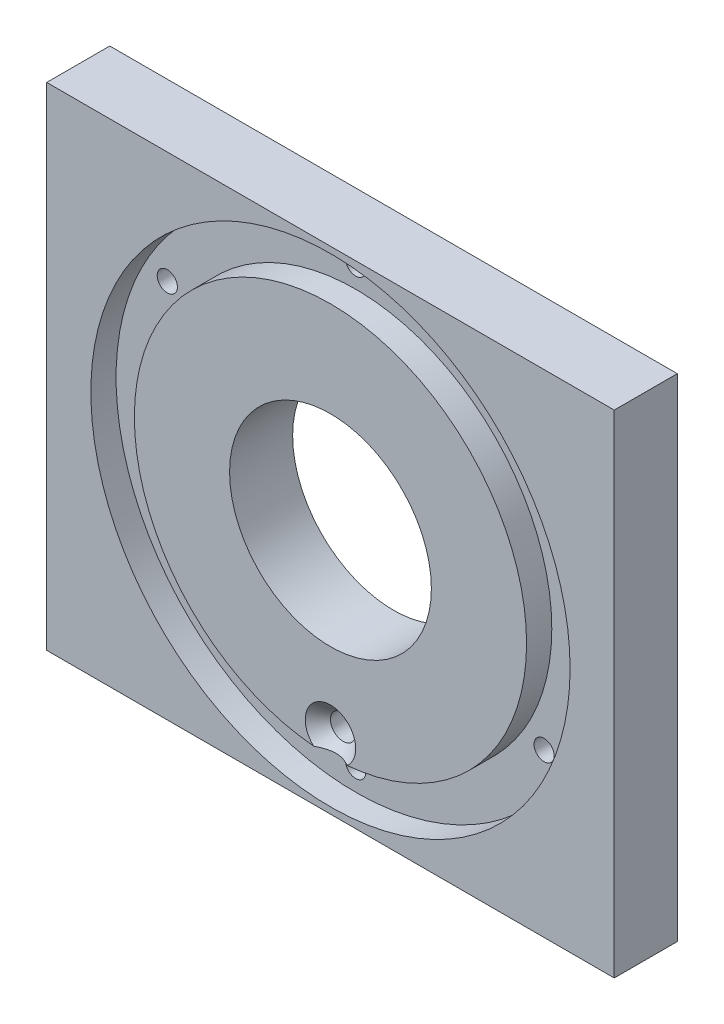
ISO-10303-21;
HEADER;
FILE_DESCRIPTION(('STEP AP214'),'2;1');
FILE_NAME('part.step','',(''),(''),'','','');
FILE_SCHEMA(('AUTOMOTIVE_DESIGN { 1 0 10303 214 1 1 1 1 }'));
ENDSEC;
DATA;
#1=APPLICATION_CONTEXT('core data for automotive mechanical design processes');
#2=APPLICATION_PROTOCOL_DEFINITION('international standard','automotive_design',2000,#1);
#3=PRODUCT_CONTEXT('',#1,'mechanical');
#4=PRODUCT('Part','Part','',(#3));
#5=PRODUCT_RELATED_PRODUCT_CATEGORY('part','',(#4));
#6=PRODUCT_DEFINITION_FORMATION('','',#4);
#7=PRODUCT_DEFINITION_CONTEXT('part definition',#1,'design');
#8=PRODUCT_DEFINITION('design','',#6,#7);
#9=PRODUCT_DEFINITION_SHAPE('','',#8);
#10=(LENGTH_UNIT() NAMED_UNIT(*) SI_UNIT(.MILLI.,.METRE.));
#11=(NAMED_UNIT(*) PLANE_ANGLE_UNIT() SI_UNIT($,.RADIAN.));
#12=(NAMED_UNIT(*) SI_UNIT($,.STERADIAN.) SOLID_ANGLE_UNIT());
#13=UNCERTAINTY_MEASURE_WITH_UNIT(LENGTH_MEASURE(1.E-05),#10,'distance_accuracy_value','');
#14=(GEOMETRIC_REPRESENTATION_CONTEXT(3) GLOBAL_UNCERTAINTY_ASSIGNED_CONTEXT((#13)) GLOBAL_UNIT_ASSIGNED_CONTEXT((#10,
#11,#12)) REPRESENTATION_CONTEXT('',''));
#15=CARTESIAN_POINT('',(0.,0.,0.));
#16=DIRECTION('',(0.,0.,1.));
#17=DIRECTION('',(1.,0.,0.));
#18=AXIS2_PLACEMENT_3D('',#15,#16,#17);
#19=CARTESIAN_POINT('',(0.,0.,10.));
#20=DIRECTION('',(0.,0.,-1.));
#21=DIRECTION('',(-1.,0.,0.));
#22=AXIS2_PLACEMENT_3D('',#19,#20,#21);
#23=PLANE('',#22);
#24=CARTESIAN_POINT('',(0.,0.,10.));
#25=DIRECTION('',(0.,0.,1.));
#26=DIRECTION('',(1.,0.,0.));
#27=AXIS2_PLACEMENT_3D('',#24,#25,#26);
#28=CIRCLE('',#27,16.);
#29=CARTESIAN_POINT('',(16.,0.,10.));
#30=VERTEX_POINT('',#29);
#31=EDGE_CURVE('E254',#30,#30,#28,.T.);
#32=ORIENTED_EDGE('',*,*,#31,.F.);
#33=EDGE_LOOP('',(#32));
#34=FACE_BOUND('',#33,.T.);
#35=CARTESIAN_POINT('',(0.,0.,10.));
#36=DIRECTION('',(0.,0.,1.));
#37=DIRECTION('',(1.,0.,0.));
#38=AXIS2_PLACEMENT_3D('',#35,#36,#37);
#39=CIRCLE('',#38,31.1);
#40=CARTESIAN_POINT('',(2.6616618578743,-30.9858928571429,10.));
#41=VERTEX_POINT('',#40);
#42=CARTESIAN_POINT('',(-2.6616618578743,-30.9858928571429,10.));
#43=VERTEX_POINT('',#42);
#44=EDGE_CURVE('E132',#41,#43,#39,.T.);
#45=ORIENTED_EDGE('',*,*,#44,.T.);
#46=CARTESIAN_POINT('',(0.,-28.,10.));
#47=DIRECTION('',(0.,0.,-1.));
#48=DIRECTION('',(-1.,0.,0.));
#49=AXIS2_PLACEMENT_3D('',#46,#47,#48);
#50=CIRCLE('',#49,3.99999999999998);
#51=EDGE_CURVE('E52',#43,#41,#50,.T.);
#52=ORIENTED_EDGE('',*,*,#51,.T.);
#53=EDGE_LOOP('',(#45,#52));
#54=FACE_BOUND('',#53,.T.);
#55=ADVANCED_FACE('F39',(#34,#54),#23,.F.);
#56=CARTESIAN_POINT('',(0.,0.,10.));
#57=DIRECTION('',(0.,0.,1.));
#58=DIRECTION('',(1.,0.,0.));
#59=AXIS2_PLACEMENT_3D('',#56,#57,#58);
#60=CIRCLE('',#59,38.);
#61=CARTESIAN_POINT('',(38.,0.,10.));
#62=VERTEX_POINT('',#61);
#63=EDGE_CURVE('E340',#62,#62,#60,.T.);
#64=ORIENTED_EDGE('',*,*,#63,.F.);
#65=EDGE_LOOP('',(#64));
#66=FACE_BOUND('',#65,.T.);
#67=DIRECTION('',(0.,1.,0.));
#68=VECTOR('',#67,1.);
#69=CARTESIAN_POINT('',(45.,-39.,10.));
#70=LINE('',#69,#68);
#71=CARTESIAN_POINT('',(45.,-39.,10.));
#72=VERTEX_POINT('',#71);
#73=CARTESIAN_POINT('',(45.,39.,10.));
#74=VERTEX_POINT('',#73);
#75=EDGE_CURVE('E105',#72,#74,#70,.T.);
#76=ORIENTED_EDGE('',*,*,#75,.T.);
#77=DIRECTION('',(-1.,0.,0.));
#78=VECTOR('',#77,1.);
#79=CARTESIAN_POINT('',(-45.,39.,10.));
#80=LINE('',#79,#78);
#81=CARTESIAN_POINT('',(-45.,39.,10.));
#82=VERTEX_POINT('',#81);
#83=EDGE_CURVE('E94',#74,#82,#80,.T.);
#84=ORIENTED_EDGE('',*,*,#83,.T.);
#85=DIRECTION('',(0.,-1.,0.));
#86=VECTOR('',#85,1.);
#87=CARTESIAN_POINT('',(-45.,-39.,10.));
#88=LINE('',#87,#86);
#89=CARTESIAN_POINT('',(-45.,-39.,10.));
#90=VERTEX_POINT('',#89);
#91=EDGE_CURVE('E104',#82,#90,#88,.T.);
#92=ORIENTED_EDGE('',*,*,#91,.T.);
#93=DIRECTION('',(1.,0.,0.));
#94=VECTOR('',#93,1.);
#95=CARTESIAN_POINT('',(-45.,-39.,10.));
#96=LINE('',#95,#94);
#97=EDGE_CURVE('E110',#90,#72,#96,.T.);
#98=ORIENTED_EDGE('',*,*,#97,.T.);
#99=EDGE_LOOP('',(#76,#84,#92,#98));
#100=FACE_BOUND('',#99,.T.);
#101=ADVANCED_FACE('F108',(#66,#100),#23,.F.);
#102=CARTESIAN_POINT('',(0.,0.,0.));
#103=DIRECTION('',(0.,0.,-1.));
#104=DIRECTION('',(-1.,0.,0.));
#105=AXIS2_PLACEMENT_3D('',#102,#103,#104);
#106=PLANE('',#105);
#107=CARTESIAN_POINT('',(0.,34.5,0.));
#108=DIRECTION('',(0.,0.,-1.));
#109=DIRECTION('',(-1.,0.,0.));
#110=AXIS2_PLACEMENT_3D('',#107,#108,#109);
#111=CIRCLE('',#110,3.);
#112=CARTESIAN_POINT('',(-3.,34.5,0.));
#113=VERTEX_POINT('',#112);
#114=EDGE_CURVE('E411',#113,#113,#111,.T.);
#115=ORIENTED_EDGE('',*,*,#114,.F.);
#116=EDGE_LOOP('',(#115));
#117=FACE_BOUND('',#116,.T.);
#118=CARTESIAN_POINT('',(-29.8778764305631,17.25,0.));
#119=DIRECTION('',(0.,0.,-1.));
#120=DIRECTION('',(-1.,0.,0.));
#121=AXIS2_PLACEMENT_3D('',#118,#119,#120);
#122=CIRCLE('',#121,3.);
#123=CARTESIAN_POINT('',(-32.8778764305631,17.25,0.));
#124=VERTEX_POINT('',#123);
#125=EDGE_CURVE('E156',#124,#124,#122,.T.);
#126=ORIENTED_EDGE('',*,*,#125,.F.);
#127=EDGE_LOOP('',(#126));
#128=FACE_BOUND('',#127,.T.);
#129=CARTESIAN_POINT('',(-29.8778764305631,-17.25,0.));
#130=DIRECTION('',(0.,0.,-1.));
#131=DIRECTION('',(-1.,0.,0.));
#132=AXIS2_PLACEMENT_3D('',#129,#130,#131);
#133=CIRCLE('',#132,3.);
#134=CARTESIAN_POINT('',(-32.8778764305631,-17.25,0.));
#135=VERTEX_POINT('',#134);
#136=EDGE_CURVE('E152',#135,#135,#133,.T.);
#137=ORIENTED_EDGE('',*,*,#136,.F.);
#138=EDGE_LOOP('',(#137));
#139=FACE_BOUND('',#138,.T.);
#140=CARTESIAN_POINT('',(0.,-34.5,0.));
#141=DIRECTION('',(0.,0.,-1.));
#142=DIRECTION('',(-1.,0.,0.));
#143=AXIS2_PLACEMENT_3D('',#140,#141,#142);
#144=CIRCLE('',#143,3.);
#145=CARTESIAN_POINT('',(1.28357281507426,-31.7884615384616,0.));
#146=VERTEX_POINT('',#145);
#147=CARTESIAN_POINT('',(-1.28357281507426,-31.7884615384616,0.));
#148=VERTEX_POINT('',#147);
#149=EDGE_CURVE('E147',#146,#148,#144,.T.);
#150=ORIENTED_EDGE('',*,*,#149,.F.);
#151=CARTESIAN_POINT('',(0.,-28.,0.));
#152=DIRECTION('',(0.,0.,-1.));
#153=DIRECTION('',(-1.,0.,0.));
#154=AXIS2_PLACEMENT_3D('',#151,#152,#153);
#155=CIRCLE('',#154,4.00000000000002);
#156=EDGE_CURVE('E161',#146,#148,#155,.F.);
#157=ORIENTED_EDGE('',*,*,#156,.T.);
#158=EDGE_LOOP('',(#150,#157));
#159=FACE_BOUND('',#158,.T.);
#160=CARTESIAN_POINT('',(29.8778764305631,-17.25,0.));
#161=DIRECTION('',(0.,0.,-1.));
#162=DIRECTION('',(-1.,0.,0.));
#163=AXIS2_PLACEMENT_3D('',#160,#161,#162);
#164=CIRCLE('',#163,3.);
#165=CARTESIAN_POINT('',(26.8778764305631,-17.25,0.));
#166=VERTEX_POINT('',#165);
#167=EDGE_CURVE('E142',#166,#166,#164,.T.);
#168=ORIENTED_EDGE('',*,*,#167,.F.);
#169=EDGE_LOOP('',(#168));
#170=FACE_BOUND('',#169,.T.);
#171=CARTESIAN_POINT('',(29.8778764305631,17.25,0.));
#172=DIRECTION('',(0.,0.,-1.));
#173=DIRECTION('',(-1.,0.,0.));
#174=AXIS2_PLACEMENT_3D('',#171,#172,#173);
#175=CIRCLE('',#174,3.);
#176=CARTESIAN_POINT('',(26.8778764305631,17.25,0.));
#177=VERTEX_POINT('',#176);
#178=EDGE_CURVE('E137',#177,#177,#175,.T.);
#179=ORIENTED_EDGE('',*,*,#178,.F.);
#180=EDGE_LOOP('',(#179));
#181=FACE_BOUND('',#180,.T.);
#182=DIRECTION('',(0.,1.,0.));
#183=VECTOR('',#182,1.);
#184=CARTESIAN_POINT('',(45.,-39.,0.));
#185=LINE('',#184,#183);
#186=CARTESIAN_POINT('',(45.,-39.,0.));
#187=VERTEX_POINT('',#186);
#188=CARTESIAN_POINT('',(45.,39.,0.));
#189=VERTEX_POINT('',#188);
#190=EDGE_CURVE('E119',#187,#189,#185,.T.);
#191=ORIENTED_EDGE('',*,*,#190,.F.);
#192=DIRECTION('',(1.,0.,0.));
#193=VECTOR('',#192,1.);
#194=CARTESIAN_POINT('',(-45.,-39.,0.));
#195=LINE('',#194,#193);
#196=CARTESIAN_POINT('',(-45.,-39.,0.));
#197=VERTEX_POINT('',#196);
#198=EDGE_CURVE('E115',#197,#187,#195,.T.);
#199=ORIENTED_EDGE('',*,*,#198,.F.);
#200=DIRECTION('',(0.,-1.,0.));
#201=VECTOR('',#200,1.);
#202=CARTESIAN_POINT('',(-45.,-39.,0.));
#203=LINE('',#202,#201);
#204=CARTESIAN_POINT('',(-45.,39.,0.));
#205=VERTEX_POINT('',#204);
#206=EDGE_CURVE('E358',#205,#197,#203,.T.);
#207=ORIENTED_EDGE('',*,*,#206,.F.);
#208=DIRECTION('',(-1.,0.,0.));
#209=VECTOR('',#208,1.);
#210=CARTESIAN_POINT('',(-45.,39.,0.));
#211=LINE('',#210,#209);
#212=EDGE_CURVE('E356',#189,#205,#211,.T.);
#213=ORIENTED_EDGE('',*,*,#212,.F.);
#214=EDGE_LOOP('',(#191,#199,#207,#213));
#215=FACE_BOUND('',#214,.T.);
#216=CARTESIAN_POINT('',(0.,0.,0.));
#217=DIRECTION('',(0.,0.,1.));
#218=DIRECTION('',(1.,0.,0.));
#219=AXIS2_PLACEMENT_3D('',#216,#217,#218);
#220=CIRCLE('',#219,16.);
#221=CARTESIAN_POINT('',(16.,0.,0.));
#222=VERTEX_POINT('',#221);
#223=EDGE_CURVE('E345',#222,#222,#220,.T.);
#224=ORIENTED_EDGE('',*,*,#223,.T.);
#225=EDGE_LOOP('',(#224));
#226=FACE_BOUND('',#225,.T.);
#227=ADVANCED_FACE('F231',(#117,#128,#139,#159,#170,#181,#215,#226),#106,.T.);
#228=CARTESIAN_POINT('',(45.,-39.,10.));
#229=DIRECTION('',(-1.,0.,0.));
#230=DIRECTION('',(0.,0.,1.));
#231=AXIS2_PLACEMENT_3D('',#228,#229,#230);
#232=PLANE('',#231);
#233=ORIENTED_EDGE('',*,*,#190,.T.);
#234=DIRECTION('',(0.,0.,-1.));
#235=VECTOR('',#234,1.);
#236=CARTESIAN_POINT('',(45.,39.,10.));
#237=LINE('',#236,#235);
#238=EDGE_CURVE('E98',#74,#189,#237,.T.);
#239=ORIENTED_EDGE('',*,*,#238,.F.);
#240=ORIENTED_EDGE('',*,*,#75,.F.);
#241=DIRECTION('',(0.,0.,-1.));
#242=VECTOR('',#241,1.);
#243=CARTESIAN_POINT('',(45.,-39.,10.));
#244=LINE('',#243,#242);
#245=EDGE_CURVE('E354',#72,#187,#244,.T.);
#246=ORIENTED_EDGE('',*,*,#245,.T.);
#247=EDGE_LOOP('',(#233,#239,#240,#246));
#248=FACE_BOUND('',#247,.T.);
#249=ADVANCED_FACE('F117',(#248),#232,.F.);
#250=CARTESIAN_POINT('',(-45.,39.,10.));
#251=DIRECTION('',(0.,-1.,0.));
#252=DIRECTION('',(0.,0.,-1.));
#253=AXIS2_PLACEMENT_3D('',#250,#251,#252);
#254=PLANE('',#253);
#255=ORIENTED_EDGE('',*,*,#212,.T.);
#256=DIRECTION('',(0.,0.,-1.));
#257=VECTOR('',#256,1.);
#258=CARTESIAN_POINT('',(-45.,39.,10.));
#259=LINE('',#258,#257);
#260=EDGE_CURVE('E101',#82,#205,#259,.T.);
#261=ORIENTED_EDGE('',*,*,#260,.F.);
#262=ORIENTED_EDGE('',*,*,#83,.F.);
#263=ORIENTED_EDGE('',*,*,#238,.T.);
#264=EDGE_LOOP('',(#255,#261,#262,#263));
#265=FACE_BOUND('',#264,.T.);
#266=ADVANCED_FACE('F96',(#265),#254,.F.);
#267=CARTESIAN_POINT('',(-45.,-39.,10.));
#268=DIRECTION('',(1.,0.,0.));
#269=DIRECTION('',(0.,0.,-1.));
#270=AXIS2_PLACEMENT_3D('',#267,#268,#269);
#271=PLANE('',#270);
#272=ORIENTED_EDGE('',*,*,#206,.T.);
#273=DIRECTION('',(0.,0.,-1.));
#274=VECTOR('',#273,1.);
#275=CARTESIAN_POINT('',(-45.,-39.,10.));
#276=LINE('',#275,#274);
#277=EDGE_CURVE('E125',#90,#197,#276,.T.);
#278=ORIENTED_EDGE('',*,*,#277,.F.);
#279=ORIENTED_EDGE('',*,*,#91,.F.);
#280=ORIENTED_EDGE('',*,*,#260,.T.);
#281=EDGE_LOOP('',(#272,#278,#279,#280));
#282=FACE_BOUND('',#281,.T.);
#283=ADVANCED_FACE('F238',(#282),#271,.F.);
#284=CARTESIAN_POINT('',(-45.,-39.,10.));
#285=DIRECTION('',(0.,1.,0.));
#286=DIRECTION('',(0.,0.,1.));
#287=AXIS2_PLACEMENT_3D('',#284,#285,#286);
#288=PLANE('',#287);
#289=ORIENTED_EDGE('',*,*,#198,.T.);
#290=ORIENTED_EDGE('',*,*,#245,.F.);
#291=ORIENTED_EDGE('',*,*,#97,.F.);
#292=ORIENTED_EDGE('',*,*,#277,.T.);
#293=EDGE_LOOP('',(#289,#290,#291,#292));
#294=FACE_BOUND('',#293,.T.);
#295=ADVANCED_FACE('F227',(#294),#288,.F.);
#296=CARTESIAN_POINT('',(0.,0.,10.));
#297=DIRECTION('',(0.,0.,-1.));
#298=DIRECTION('',(-1.,0.,0.));
#299=AXIS2_PLACEMENT_3D('',#296,#297,#298);
#300=CYLINDRICAL_SURFACE('',#299,16.);
#301=ORIENTED_EDGE('',*,*,#31,.T.);
#302=EDGE_LOOP('',(#301));
#303=FACE_BOUND('',#302,.T.);
#304=ORIENTED_EDGE('',*,*,#223,.F.);
#305=EDGE_LOOP('',(#304));
#306=FACE_BOUND('',#305,.T.);
#307=ADVANCED_FACE('F223',(#303,#306),#300,.F.);
#308=CARTESIAN_POINT('',(0.,0.,6.));
#309=DIRECTION('',(0.,0.,1.));
#310=DIRECTION('',(1.,0.,0.));
#311=AXIS2_PLACEMENT_3D('',#308,#309,#310);
#312=CYLINDRICAL_SURFACE('',#311,38.);
#313=CARTESIAN_POINT('',(0.,0.,6.));
#314=DIRECTION('',(0.,0.,1.));
#315=DIRECTION('',(1.,0.,0.));
#316=AXIS2_PLACEMENT_3D('',#313,#314,#315);
#317=CIRCLE('',#316,38.);
#318=CARTESIAN_POINT('',(38.,0.,6.));
#319=VERTEX_POINT('',#318);
#320=EDGE_CURVE('E342',#319,#319,#317,.T.);
#321=ORIENTED_EDGE('',*,*,#320,.F.);
#322=EDGE_LOOP('',(#321));
#323=FACE_BOUND('',#322,.T.);
#324=ORIENTED_EDGE('',*,*,#63,.T.);
#325=EDGE_LOOP('',(#324));
#326=FACE_BOUND('',#325,.T.);
#327=ADVANCED_FACE('F219',(#323,#326),#312,.F.);
#328=CARTESIAN_POINT('',(0.,0.,6.));
#329=DIRECTION('',(0.,0.,1.));
#330=DIRECTION('',(1.,0.,0.));
#331=AXIS2_PLACEMENT_3D('',#328,#329,#330);
#332=PLANE('',#331);
#333=CARTESIAN_POINT('',(0.,34.5,6.));
#334=DIRECTION('',(0.,0.,1.));
#335=DIRECTION('',(1.,0.,0.));
#336=AXIS2_PLACEMENT_3D('',#333,#334,#335);
#337=CIRCLE('',#336,1.6);
#338=CARTESIAN_POINT('',(1.6,34.5,6.));
#339=VERTEX_POINT('',#338);
#340=EDGE_CURVE('E154',#339,#339,#337,.T.);
#341=ORIENTED_EDGE('',*,*,#340,.F.);
#342=EDGE_LOOP('',(#341));
#343=FACE_BOUND('',#342,.T.);
#344=CARTESIAN_POINT('',(-29.8778764305631,17.25,6.));
#345=DIRECTION('',(0.,0.,1.));
#346=DIRECTION('',(1.,0.,0.));
#347=AXIS2_PLACEMENT_3D('',#344,#345,#346);
#348=CIRCLE('',#347,1.6);
#349=CARTESIAN_POINT('',(-28.2778764305631,17.25,6.));
#350=VERTEX_POINT('',#349);
#351=EDGE_CURVE('E149',#350,#350,#348,.T.);
#352=ORIENTED_EDGE('',*,*,#351,.F.);
#353=EDGE_LOOP('',(#352));
#354=FACE_BOUND('',#353,.T.);
#355=CARTESIAN_POINT('',(-29.8778764305631,-17.25,6.));
#356=DIRECTION('',(0.,0.,1.));
#357=DIRECTION('',(1.,0.,0.));
#358=AXIS2_PLACEMENT_3D('',#355,#356,#357);
#359=CIRCLE('',#358,1.6);
#360=CARTESIAN_POINT('',(-28.2778764305631,-17.25,6.));
#361=VERTEX_POINT('',#360);
#362=EDGE_CURVE('E144',#361,#361,#359,.T.);
#363=ORIENTED_EDGE('',*,*,#362,.F.);
#364=EDGE_LOOP('',(#363));
#365=FACE_BOUND('',#364,.T.);
#366=CARTESIAN_POINT('',(0.,-34.5,6.));
#367=DIRECTION('',(0.,0.,1.));
#368=DIRECTION('',(1.,0.,0.));
#369=AXIS2_PLACEMENT_3D('',#366,#367,#368);
#370=CIRCLE('',#369,1.6);
#371=CARTESIAN_POINT('',(1.59999999999999,-34.5,6.));
#372=VERTEX_POINT('',#371);
#373=EDGE_CURVE('E139',#372,#372,#370,.T.);
#374=ORIENTED_EDGE('',*,*,#373,.F.);
#375=EDGE_LOOP('',(#374));
#376=FACE_BOUND('',#375,.T.);
#377=CARTESIAN_POINT('',(29.8778764305631,-17.25,6.));
#378=DIRECTION('',(0.,0.,1.));
#379=DIRECTION('',(1.,0.,0.));
#380=AXIS2_PLACEMENT_3D('',#377,#378,#379);
#381=CIRCLE('',#380,1.6);
#382=CARTESIAN_POINT('',(31.4778764305631,-17.25,6.));
#383=VERTEX_POINT('',#382);
#384=EDGE_CURVE('E134',#383,#383,#381,.T.);
#385=ORIENTED_EDGE('',*,*,#384,.F.);
#386=EDGE_LOOP('',(#385));
#387=FACE_BOUND('',#386,.T.);
#388=CARTESIAN_POINT('',(29.8778764305631,17.25,6.));
#389=DIRECTION('',(0.,0.,1.));
#390=DIRECTION('',(1.,0.,0.));
#391=AXIS2_PLACEMENT_3D('',#388,#389,#390);
#392=CIRCLE('',#391,1.6);
#393=CARTESIAN_POINT('',(31.4778764305631,17.25,6.));
#394=VERTEX_POINT('',#393);
#395=EDGE_CURVE('E129',#394,#394,#392,.T.);
#396=ORIENTED_EDGE('',*,*,#395,.F.);
#397=EDGE_LOOP('',(#396));
#398=FACE_BOUND('',#397,.T.);
#399=CARTESIAN_POINT('',(0.,0.,6.));
#400=DIRECTION('',(0.,0.,1.));
#401=DIRECTION('',(1.,0.,0.));
#402=AXIS2_PLACEMENT_3D('',#399,#400,#401);
#403=CIRCLE('',#402,31.1);
#404=CARTESIAN_POINT('',(31.1,0.,6.));
#405=VERTEX_POINT('',#404);
#406=EDGE_CURVE('E255',#405,#405,#403,.T.);
#407=ORIENTED_EDGE('',*,*,#406,.F.);
#408=EDGE_LOOP('',(#407));
#409=FACE_BOUND('',#408,.T.);
#410=ORIENTED_EDGE('',*,*,#320,.T.);
#411=EDGE_LOOP('',(#410));
#412=FACE_BOUND('',#411,.T.);
#413=ADVANCED_FACE('F215',(#343,#354,#365,#376,#387,#398,#409,#412),#332,.T.);
#414=CARTESIAN_POINT('',(0.,0.,6.));
#415=DIRECTION('',(0.,0.,1.));
#416=DIRECTION('',(1.,0.,0.));
#417=AXIS2_PLACEMENT_3D('',#414,#415,#416);
#418=CYLINDRICAL_SURFACE('',#417,31.1);
#419=ORIENTED_EDGE('',*,*,#406,.T.);
#420=EDGE_LOOP('',(#419));
#421=FACE_BOUND('',#420,.T.);
#422=ORIENTED_EDGE('',*,*,#44,.F.);
#423=CARTESIAN_POINT('',(2.6616618578743,-30.9858928571429,10.));
#424=CARTESIAN_POINT('',(2.59335727332655,-30.9917597658874,9.95893430751013));
#425=CARTESIAN_POINT('',(2.52462241236969,-30.9974369379025,9.91855844550887));
#426=CARTESIAN_POINT('',(2.38618014138941,-31.0084016443111,9.83941028292786));
#427=CARTESIAN_POINT('',(2.31647246213609,-31.0136890681913,9.80063843852467));
#428=CARTESIAN_POINT('',(2.10509897633974,-31.028995986912,9.68673212313276));
#429=CARTESIAN_POINT('',(1.96184373029193,-31.0384029465027,9.61441004414233));
#430=CARTESIAN_POINT('',(1.66772623831287,-31.0556082763101,9.478596700324));
#431=CARTESIAN_POINT('',(1.51677111394977,-31.063372632252,9.41529965413895));
#432=CARTESIAN_POINT('',(1.2097147773709,-31.0768420038133,9.30303054805561));
#433=CARTESIAN_POINT('',(1.05362466956158,-31.0825511804926,9.25402958189625));
#434=CARTESIAN_POINT('',(0.793390222822673,-31.090045189161,9.18874970376968));
#435=CARTESIAN_POINT('',(0.690628616407899,-31.0925032951742,9.16703544455979));
#436=CARTESIAN_POINT('',(0.483595737199375,-31.0964120930832,9.13228805209618));
#437=CARTESIAN_POINT('',(0.379324422379193,-31.097862756879,9.11925516098615));
#438=CARTESIAN_POINT('',(0.171003782856565,-31.099702628549,9.10269604416167));
#439=CARTESIAN_POINT('',(0.0669617089135984,-31.1001017594113,9.09908094929957));
#440=CARTESIAN_POINT('',(-0.141015449004784,-31.099854157322,9.10131720935704));
#441=CARTESIAN_POINT('',(-0.244950535044868,-31.0992074449467,9.1071683780333));
#442=CARTESIAN_POINT('',(-0.45154110946125,-31.0968929110408,9.12795472867873));
#443=CARTESIAN_POINT('',(-0.554199667544821,-31.0952284299714,9.14286019212256));
#444=CARTESIAN_POINT('',(-0.757930681416162,-31.0909301099347,9.18092376453948));
#445=CARTESIAN_POINT('',(-0.859002952831615,-31.0882961591443,9.20408282551049));
#446=CARTESIAN_POINT('',(-1.16093807379608,-31.0789795448983,9.28481770989987));
#447=CARTESIAN_POINT('',(-1.35883594979363,-31.0709025446472,9.35345252011893));
#448=CARTESIAN_POINT('',(-1.64940317132897,-31.0563837698248,9.47190041245359));
#449=CARTESIAN_POINT('',(-1.74545985983569,-31.0511263836281,9.51409899371604));
#450=CARTESIAN_POINT('',(-1.9355690486805,-31.0398554589336,9.60278470865609));
#451=CARTESIAN_POINT('',(-2.02962123140814,-31.0338418016325,9.64927251582612));
#452=CARTESIAN_POINT('',(-2.21428053982071,-31.02120875707,9.74493726032162));
#453=CARTESIAN_POINT('',(-2.30491898999043,-31.0146012231643,9.79405600585086));
#454=CARTESIAN_POINT('',(-2.48449870048985,-31.0007313829298,9.89507581076144));
#455=CARTESIAN_POINT('',(-2.57344112903851,-30.9934695485925,9.94697485373977));
#456=CARTESIAN_POINT('',(-2.66166185787431,-30.9858928571429,9.99999999999999));
#457=B_SPLINE_CURVE_WITH_KNOTS('',3,(#423,#424,#425,#426,#427,#428,#429,#430,#431,#432,#433,
#434,#435,#436,#437,#438,#439,#440,#441,#442,#443,#444,#445,#446,#447,#448,#449,#450,#451,#452,
#453,#454,#455,#456),.UNSPECIFIED.,.F.,.F.,(4,2,2,2,2,2,2,2,2,2,2,2,2,2,2,2,4),(0.,
0.239734644191588,0.479537005787954,0.961468211246724,1.45256963002226,1.94267106248403,
2.25752793848324,2.57239359621132,2.88427714198336,3.19615455170026,3.50701378946577,
3.81790889439964,4.4447315450547,4.75982695825508,5.07497193207775,5.38483035342385,
5.69446701550038),.UNSPECIFIED.);
#458=EDGE_CURVE('E11',#41,#43,#457,.T.);
#459=ORIENTED_EDGE('',*,*,#458,.T.);
#460=EDGE_LOOP('',(#422,#459));
#461=FACE_BOUND('',#460,.T.);
#462=ADVANCED_FACE('F210',(#421,#461),#418,.T.);
#463=CARTESIAN_POINT('',(29.8778764305631,17.25,0.));
#464=DIRECTION('',(0.,0.,-1.));
#465=DIRECTION('',(-1.,0.,0.));
#466=AXIS2_PLACEMENT_3D('',#463,#464,#465);
#467=CYLINDRICAL_SURFACE('',#466,1.6);
#468=ORIENTED_EDGE('',*,*,#395,.T.);
#469=EDGE_LOOP('',(#468));
#470=FACE_BOUND('',#469,.T.);
#471=CARTESIAN_POINT('',(29.8778764305631,17.25,3.4));
#472=DIRECTION('',(0.,0.,-1.));
#473=DIRECTION('',(-1.,0.,0.));
#474=AXIS2_PLACEMENT_3D('',#471,#472,#473);
#475=CIRCLE('',#474,1.6);
#476=CARTESIAN_POINT('',(28.2778764305631,17.25,3.4));
#477=VERTEX_POINT('',#476);
#478=EDGE_CURVE('E133',#477,#477,#475,.T.);
#479=ORIENTED_EDGE('',*,*,#478,.T.);
#480=EDGE_LOOP('',(#479));
#481=FACE_BOUND('',#480,.T.);
#482=ADVANCED_FACE('F207',(#470,#481),#467,.F.);
#483=CARTESIAN_POINT('',(31.4778764305631,17.25,3.4));
#484=DIRECTION('',(0.,0.,1.));
#485=DIRECTION('',(1.,0.,0.));
#486=AXIS2_PLACEMENT_3D('',#483,#484,#485);
#487=PLANE('',#486);
#488=ORIENTED_EDGE('',*,*,#478,.F.);
#489=EDGE_LOOP('',(#488));
#490=FACE_BOUND('',#489,.T.);
#491=CARTESIAN_POINT('',(29.8778764305631,17.25,3.4));
#492=DIRECTION('',(0.,0.,-1.));
#493=DIRECTION('',(-1.,0.,0.));
#494=AXIS2_PLACEMENT_3D('',#491,#492,#493);
#495=CIRCLE('',#494,3.);
#496=CARTESIAN_POINT('',(26.8778764305631,17.25,3.4));
#497=VERTEX_POINT('',#496);
#498=EDGE_CURVE('E334',#497,#497,#495,.T.);
#499=ORIENTED_EDGE('',*,*,#498,.T.);
#500=EDGE_LOOP('',(#499));
#501=FACE_BOUND('',#500,.T.);
#502=ADVANCED_FACE('F203',(#490,#501),#487,.F.);
#503=CARTESIAN_POINT('',(29.8778764305631,17.25,0.));
#504=DIRECTION('',(0.,0.,-1.));
#505=DIRECTION('',(-1.,0.,0.));
#506=AXIS2_PLACEMENT_3D('',#503,#504,#505);
#507=CYLINDRICAL_SURFACE('',#506,3.);
#508=ORIENTED_EDGE('',*,*,#498,.F.);
#509=EDGE_LOOP('',(#508));
#510=FACE_BOUND('',#509,.T.);
#511=ORIENTED_EDGE('',*,*,#178,.T.);
#512=EDGE_LOOP('',(#511));
#513=FACE_BOUND('',#512,.T.);
#514=ADVANCED_FACE('F199',(#510,#513),#507,.F.);
#515=CARTESIAN_POINT('',(29.8778764305631,-17.25,0.));
#516=DIRECTION('',(0.,0.,-1.));
#517=DIRECTION('',(-1.,0.,0.));
#518=AXIS2_PLACEMENT_3D('',#515,#516,#517);
#519=CYLINDRICAL_SURFACE('',#518,1.6);
#520=ORIENTED_EDGE('',*,*,#384,.T.);
#521=EDGE_LOOP('',(#520));
#522=FACE_BOUND('',#521,.T.);
#523=CARTESIAN_POINT('',(29.8778764305631,-17.25,3.4));
#524=DIRECTION('',(0.,0.,-1.));
#525=DIRECTION('',(-1.,0.,0.));
#526=AXIS2_PLACEMENT_3D('',#523,#524,#525);
#527=CIRCLE('',#526,1.6);
#528=CARTESIAN_POINT('',(28.2778764305631,-17.25,3.4));
#529=VERTEX_POINT('',#528);
#530=EDGE_CURVE('E138',#529,#529,#527,.T.);
#531=ORIENTED_EDGE('',*,*,#530,.T.);
#532=EDGE_LOOP('',(#531));
#533=FACE_BOUND('',#532,.T.);
#534=ADVANCED_FACE('F195',(#522,#533),#519,.F.);
#535=CARTESIAN_POINT('',(31.4778764305631,-17.25,3.4));
#536=DIRECTION('',(0.,0.,1.));
#537=DIRECTION('',(1.,0.,0.));
#538=AXIS2_PLACEMENT_3D('',#535,#536,#537);
#539=PLANE('',#538);
#540=ORIENTED_EDGE('',*,*,#530,.F.);
#541=EDGE_LOOP('',(#540));
#542=FACE_BOUND('',#541,.T.);
#543=CARTESIAN_POINT('',(29.8778764305631,-17.25,3.4));
#544=DIRECTION('',(0.,0.,-1.));
#545=DIRECTION('',(-1.,0.,0.));
#546=AXIS2_PLACEMENT_3D('',#543,#544,#545);
#547=CIRCLE('',#546,3.);
#548=CARTESIAN_POINT('',(26.8778764305631,-17.25,3.4));
#549=VERTEX_POINT('',#548);
#550=EDGE_CURVE('E327',#549,#549,#547,.T.);
#551=ORIENTED_EDGE('',*,*,#550,.T.);
#552=EDGE_LOOP('',(#551));
#553=FACE_BOUND('',#552,.T.);
#554=ADVANCED_FACE('F191',(#542,#553),#539,.F.);
#555=CARTESIAN_POINT('',(29.8778764305631,-17.25,0.));
#556=DIRECTION('',(0.,0.,-1.));
#557=DIRECTION('',(-1.,0.,0.));
#558=AXIS2_PLACEMENT_3D('',#555,#556,#557);
#559=CYLINDRICAL_SURFACE('',#558,3.);
#560=ORIENTED_EDGE('',*,*,#550,.F.);
#561=EDGE_LOOP('',(#560));
#562=FACE_BOUND('',#561,.T.);
#563=ORIENTED_EDGE('',*,*,#167,.T.);
#564=EDGE_LOOP('',(#563));
#565=FACE_BOUND('',#564,.T.);
#566=ADVANCED_FACE('F187',(#562,#565),#559,.F.);
#567=CARTESIAN_POINT('',(0.,-34.5,0.));
#568=DIRECTION('',(0.,0.,-1.));
#569=DIRECTION('',(-1.,0.,0.));
#570=AXIS2_PLACEMENT_3D('',#567,#568,#569);
#571=CYLINDRICAL_SURFACE('',#570,1.6);
#572=ORIENTED_EDGE('',*,*,#373,.T.);
#573=EDGE_LOOP('',(#572));
#574=FACE_BOUND('',#573,.T.);
#575=CARTESIAN_POINT('',(0.,-34.5,3.4));
#576=DIRECTION('',(0.,0.,-1.));
#577=DIRECTION('',(-1.,0.,0.));
#578=AXIS2_PLACEMENT_3D('',#575,#576,#577);
#579=CIRCLE('',#578,1.6);
#580=CARTESIAN_POINT('',(-1.6,-34.5,3.4));
#581=VERTEX_POINT('',#580);
#582=EDGE_CURVE('E143',#581,#581,#579,.T.);
#583=ORIENTED_EDGE('',*,*,#582,.T.);
#584=EDGE_LOOP('',(#583));
#585=FACE_BOUND('',#584,.T.);
#586=ADVANCED_FACE('F183',(#574,#585),#571,.F.);
#587=CARTESIAN_POINT('',(1.59999999999999,-34.5,3.4));
#588=DIRECTION('',(0.,0.,1.));
#589=DIRECTION('',(1.,0.,0.));
#590=AXIS2_PLACEMENT_3D('',#587,#588,#589);
#591=PLANE('',#590);
#592=ORIENTED_EDGE('',*,*,#582,.F.);
#593=EDGE_LOOP('',(#592));
#594=FACE_BOUND('',#593,.T.);
#595=CARTESIAN_POINT('',(0.,-34.5,3.4));
#596=DIRECTION('',(0.,0.,-1.));
#597=DIRECTION('',(-1.,0.,0.));
#598=AXIS2_PLACEMENT_3D('',#595,#596,#597);
#599=CIRCLE('',#598,3.);
#600=CARTESIAN_POINT('',(-3.,-34.5,3.4));
#601=VERTEX_POINT('',#600);
#602=EDGE_CURVE('E320',#601,#601,#599,.T.);
#603=ORIENTED_EDGE('',*,*,#602,.T.);
#604=EDGE_LOOP('',(#603));
#605=FACE_BOUND('',#604,.T.);
#606=ADVANCED_FACE('F178',(#594,#605),#591,.F.);
#607=CARTESIAN_POINT('',(0.,-34.5,0.));
#608=DIRECTION('',(0.,0.,-1.));
#609=DIRECTION('',(-1.,0.,0.));
#610=AXIS2_PLACEMENT_3D('',#607,#608,#609);
#611=CYLINDRICAL_SURFACE('',#610,3.);
#612=ORIENTED_EDGE('',*,*,#602,.F.);
#613=EDGE_LOOP('',(#612));
#614=FACE_BOUND('',#613,.T.);
#615=ORIENTED_EDGE('',*,*,#149,.T.);
#616=CARTESIAN_POINT('',(-1.28357281507427,-31.7884615384616,0.));
#617=CARTESIAN_POINT('',(-1.24018032286919,-31.7679289154428,0.0333622855557656));
#618=CARTESIAN_POINT('',(-1.19578228408028,-31.7481791646469,0.0658773334681083));
#619=CARTESIAN_POINT('',(-1.10471501986312,-31.7103668543987,0.128855439401232));
#620=CARTESIAN_POINT('',(-1.0580412334804,-31.6923079143275,0.159314058225706));
#621=CARTESIAN_POINT('',(-0.913171323408342,-31.6405022764079,0.247667077759802));
#622=CARTESIAN_POINT('',(-0.81131795253569,-31.6097050513848,0.301590263871817));
#623=CARTESIAN_POINT('',(-0.623769078566004,-31.5643848356868,0.38223291381474));
#624=CARTESIAN_POINT('',(-0.540083110875392,-31.547729021109,0.412376106352594));
#625=CARTESIAN_POINT('',(-0.368548035984266,-31.521470869672,0.460268347574002));
#626=CARTESIAN_POINT('',(-0.28072503903245,-31.511829323869,0.478086265143114));
#627=CARTESIAN_POINT('',(-0.101919835433706,-31.5003845054291,0.499267518934356));
#628=CARTESIAN_POINT('',(-0.0109155874914185,-31.4986563238906,0.502492376052929));
#629=CARTESIAN_POINT('',(0.170186624129676,-31.5034579832261,0.493582155974389));
#630=CARTESIAN_POINT('',(0.260283318977719,-31.5099981039907,0.48142795814884));
#631=CARTESIAN_POINT('',(0.44678643145888,-31.5318006545126,0.441371398173242));
#632=CARTESIAN_POINT('',(0.542714714189337,-31.547985742075,0.411807816621461));
#633=CARTESIAN_POINT('',(0.728093632069044,-31.5881378494104,0.339798343138058));
#634=CARTESIAN_POINT('',(0.817517360229965,-31.6121351685695,0.297302335909578));
#635=CARTESIAN_POINT('',(0.971325044942275,-31.6607021911546,0.213113616801246));
#636=CARTESIAN_POINT('',(1.03703803386121,-31.6841056199234,0.173106756265271));
#637=CARTESIAN_POINT('',(1.16363654138659,-31.734045892947,0.0891972870432428));
#638=CARTESIAN_POINT('',(1.22456431375788,-31.7605484962744,0.0453383753126363));
#639=CARTESIAN_POINT('',(1.28357281507426,-31.7884615384616,0.));
#640=B_SPLINE_CURVE_WITH_KNOTS('',3,(#616,#617,#618,#619,#620,#621,#622,#623,#624,#625,#626,
#627,#628,#629,#630,#631,#632,#633,#634,#635,#636,#637,#638,#639),.UNSPECIFIED.,.F.,.F.,(4,2,2,
2,2,2,2,2,2,2,2,4),(0.,0.175320790167789,0.351008682546099,0.707238885700321,0.977749327453577,
1.24673577883784,1.51826946447605,1.7901410772418,2.09350730839853,2.39806443604517,
2.63901453749621,2.87751728073569),.UNSPECIFIED.);
#641=EDGE_CURVE('E164',#148,#146,#640,.T.);
#642=ORIENTED_EDGE('',*,*,#641,.T.);
#643=EDGE_LOOP('',(#615,#642));
#644=FACE_BOUND('',#643,.T.);
#645=ADVANCED_FACE('F172',(#614,#644),#611,.F.);
#646=CARTESIAN_POINT('',(-29.8778764305631,-17.25,0.));
#647=DIRECTION('',(0.,0.,-1.));
#648=DIRECTION('',(-1.,0.,0.));
#649=AXIS2_PLACEMENT_3D('',#646,#647,#648);
#650=CYLINDRICAL_SURFACE('',#649,1.6);
#651=ORIENTED_EDGE('',*,*,#362,.T.);
#652=EDGE_LOOP('',(#651));
#653=FACE_BOUND('',#652,.T.);
#654=CARTESIAN_POINT('',(-29.8778764305631,-17.25,3.4));
#655=DIRECTION('',(0.,0.,-1.));
#656=DIRECTION('',(-1.,0.,0.));
#657=AXIS2_PLACEMENT_3D('',#654,#655,#656);
#658=CIRCLE('',#657,1.6);
#659=CARTESIAN_POINT('',(-31.4778764305631,-17.25,3.4));
#660=VERTEX_POINT('',#659);
#661=EDGE_CURVE('E148',#660,#660,#658,.T.);
#662=ORIENTED_EDGE('',*,*,#661,.T.);
#663=EDGE_LOOP('',(#662));
#664=FACE_BOUND('',#663,.T.);
#665=ADVANCED_FACE('F177',(#653,#664),#650,.F.);
#666=CARTESIAN_POINT('',(-28.2778764305631,-17.25,3.4));
#667=DIRECTION('',(0.,0.,1.));
#668=DIRECTION('',(1.,0.,0.));
#669=AXIS2_PLACEMENT_3D('',#666,#667,#668);
#670=PLANE('',#669);
#671=ORIENTED_EDGE('',*,*,#661,.F.);
#672=EDGE_LOOP('',(#671));
#673=FACE_BOUND('',#672,.T.);
#674=CARTESIAN_POINT('',(-29.8778764305631,-17.25,3.4));
#675=DIRECTION('',(0.,0.,-1.));
#676=DIRECTION('',(-1.,0.,0.));
#677=AXIS2_PLACEMENT_3D('',#674,#675,#676);
#678=CIRCLE('',#677,3.);
#679=CARTESIAN_POINT('',(-32.8778764305631,-17.25,3.4));
#680=VERTEX_POINT('',#679);
#681=EDGE_CURVE('E311',#680,#680,#678,.T.);
#682=ORIENTED_EDGE('',*,*,#681,.T.);
#683=EDGE_LOOP('',(#682));
#684=FACE_BOUND('',#683,.T.);
#685=ADVANCED_FACE('F298',(#673,#684),#670,.F.);
#686=CARTESIAN_POINT('',(-29.8778764305631,-17.25,0.));
#687=DIRECTION('',(0.,0.,-1.));
#688=DIRECTION('',(-1.,0.,0.));
#689=AXIS2_PLACEMENT_3D('',#686,#687,#688);
#690=CYLINDRICAL_SURFACE('',#689,3.);
#691=ORIENTED_EDGE('',*,*,#681,.F.);
#692=EDGE_LOOP('',(#691));
#693=FACE_BOUND('',#692,.T.);
#694=ORIENTED_EDGE('',*,*,#136,.T.);
#695=EDGE_LOOP('',(#694));
#696=FACE_BOUND('',#695,.T.);
#697=ADVANCED_FACE('F295',(#693,#696),#690,.F.);
#698=CARTESIAN_POINT('',(-29.8778764305631,17.25,0.));
#699=DIRECTION('',(0.,0.,-1.));
#700=DIRECTION('',(-1.,0.,0.));
#701=AXIS2_PLACEMENT_3D('',#698,#699,#700);
#702=CYLINDRICAL_SURFACE('',#701,1.6);
#703=ORIENTED_EDGE('',*,*,#351,.T.);
#704=EDGE_LOOP('',(#703));
#705=FACE_BOUND('',#704,.T.);
#706=CARTESIAN_POINT('',(-29.8778764305631,17.25,3.4));
#707=DIRECTION('',(0.,0.,-1.));
#708=DIRECTION('',(-1.,0.,0.));
#709=AXIS2_PLACEMENT_3D('',#706,#707,#708);
#710=CIRCLE('',#709,1.6);
#711=CARTESIAN_POINT('',(-31.4778764305631,17.25,3.4));
#712=VERTEX_POINT('',#711);
#713=EDGE_CURVE('E153',#712,#712,#710,.T.);
#714=ORIENTED_EDGE('',*,*,#713,.T.);
#715=EDGE_LOOP('',(#714));
#716=FACE_BOUND('',#715,.T.);
#717=ADVANCED_FACE('F291',(#705,#716),#702,.F.);
#718=CARTESIAN_POINT('',(-28.2778764305631,17.25,3.4));
#719=DIRECTION('',(0.,0.,1.));
#720=DIRECTION('',(1.,0.,0.));
#721=AXIS2_PLACEMENT_3D('',#718,#719,#720);
#722=PLANE('',#721);
#723=ORIENTED_EDGE('',*,*,#713,.F.);
#724=EDGE_LOOP('',(#723));
#725=FACE_BOUND('',#724,.T.);
#726=CARTESIAN_POINT('',(-29.8778764305631,17.25,3.4));
#727=DIRECTION('',(0.,0.,-1.));
#728=DIRECTION('',(-1.,0.,0.));
#729=AXIS2_PLACEMENT_3D('',#726,#727,#728);
#730=CIRCLE('',#729,3.);
#731=CARTESIAN_POINT('',(-32.8778764305631,17.25,3.4));
#732=VERTEX_POINT('',#731);
#733=EDGE_CURVE('E401',#732,#732,#730,.T.);
#734=ORIENTED_EDGE('',*,*,#733,.T.);
#735=EDGE_LOOP('',(#734));
#736=FACE_BOUND('',#735,.T.);
#737=ADVANCED_FACE('F287',(#725,#736),#722,.F.);
#738=CARTESIAN_POINT('',(-29.8778764305631,17.25,0.));
#739=DIRECTION('',(0.,0.,-1.));
#740=DIRECTION('',(-1.,0.,0.));
#741=AXIS2_PLACEMENT_3D('',#738,#739,#740);
#742=CYLINDRICAL_SURFACE('',#741,3.);
#743=ORIENTED_EDGE('',*,*,#733,.F.);
#744=EDGE_LOOP('',(#743));
#745=FACE_BOUND('',#744,.T.);
#746=ORIENTED_EDGE('',*,*,#125,.T.);
#747=EDGE_LOOP('',(#746));
#748=FACE_BOUND('',#747,.T.);
#749=ADVANCED_FACE('F283',(#745,#748),#742,.F.);
#750=CARTESIAN_POINT('',(0.,34.5,0.));
#751=DIRECTION('',(0.,0.,-1.));
#752=DIRECTION('',(-1.,0.,0.));
#753=AXIS2_PLACEMENT_3D('',#750,#751,#752);
#754=CYLINDRICAL_SURFACE('',#753,1.6);
#755=ORIENTED_EDGE('',*,*,#340,.T.);
#756=EDGE_LOOP('',(#755));
#757=FACE_BOUND('',#756,.T.);
#758=CARTESIAN_POINT('',(0.,34.5,3.4));
#759=DIRECTION('',(0.,0.,-1.));
#760=DIRECTION('',(-1.,0.,0.));
#761=AXIS2_PLACEMENT_3D('',#758,#759,#760);
#762=CIRCLE('',#761,1.6);
#763=CARTESIAN_POINT('',(-1.6,34.5,3.4));
#764=VERTEX_POINT('',#763);
#765=EDGE_CURVE('E157',#764,#764,#762,.T.);
#766=ORIENTED_EDGE('',*,*,#765,.T.);
#767=EDGE_LOOP('',(#766));
#768=FACE_BOUND('',#767,.T.);
#769=ADVANCED_FACE('F279',(#757,#768),#754,.F.);
#770=CARTESIAN_POINT('',(1.6,34.5,3.4));
#771=DIRECTION('',(0.,0.,1.));
#772=DIRECTION('',(1.,0.,0.));
#773=AXIS2_PLACEMENT_3D('',#770,#771,#772);
#774=PLANE('',#773);
#775=ORIENTED_EDGE('',*,*,#765,.F.);
#776=EDGE_LOOP('',(#775));
#777=FACE_BOUND('',#776,.T.);
#778=CARTESIAN_POINT('',(0.,34.5,3.4));
#779=DIRECTION('',(0.,0.,-1.));
#780=DIRECTION('',(-1.,0.,0.));
#781=AXIS2_PLACEMENT_3D('',#778,#779,#780);
#782=CIRCLE('',#781,3.);
#783=CARTESIAN_POINT('',(-3.,34.5,3.4));
#784=VERTEX_POINT('',#783);
#785=EDGE_CURVE('E408',#784,#784,#782,.T.);
#786=ORIENTED_EDGE('',*,*,#785,.T.);
#787=EDGE_LOOP('',(#786));
#788=FACE_BOUND('',#787,.T.);
#789=ADVANCED_FACE('F273',(#777,#788),#774,.F.);
#790=CARTESIAN_POINT('',(0.,34.5,0.));
#791=DIRECTION('',(0.,0.,-1.));
#792=DIRECTION('',(-1.,0.,0.));
#793=AXIS2_PLACEMENT_3D('',#790,#791,#792);
#794=CYLINDRICAL_SURFACE('',#793,3.);
#795=ORIENTED_EDGE('',*,*,#785,.F.);
#796=EDGE_LOOP('',(#795));
#797=FACE_BOUND('',#796,.T.);
#798=ORIENTED_EDGE('',*,*,#114,.T.);
#799=EDGE_LOOP('',(#798));
#800=FACE_BOUND('',#799,.T.);
#801=ADVANCED_FACE('F267',(#797,#800),#794,.F.);
#802=CARTESIAN_POINT('',(0.,-28.,0.));
#803=DIRECTION('',(0.,0.,-1.));
#804=DIRECTION('',(-1.,0.,0.));
#805=AXIS2_PLACEMENT_3D('',#802,#803,#804);
#806=CYLINDRICAL_SURFACE('',#805,2.);
#807=CARTESIAN_POINT('',(0.,-28.,2.00000000000001));
#808=DIRECTION('',(0.,0.,-1.));
#809=DIRECTION('',(-1.,0.,0.));
#810=AXIS2_PLACEMENT_3D('',#807,#808,#809);
#811=CIRCLE('',#810,2.);
#812=CARTESIAN_POINT('',(-2.,-28.,2.00000000000001));
#813=VERTEX_POINT('',#812);
#814=EDGE_CURVE('E123',#813,#813,#811,.T.);
#815=ORIENTED_EDGE('',*,*,#814,.T.);
#816=EDGE_LOOP('',(#815));
#817=FACE_BOUND('',#816,.T.);
#818=CARTESIAN_POINT('',(0.,-28.,8.00000000000002));
#819=DIRECTION('',(0.,0.,-1.));
#820=DIRECTION('',(-1.,0.,0.));
#821=AXIS2_PLACEMENT_3D('',#818,#819,#820);
#822=CIRCLE('',#821,2.);
#823=CARTESIAN_POINT('',(-2.,-28.,8.00000000000002));
#824=VERTEX_POINT('',#823);
#825=EDGE_CURVE('E120',#824,#824,#822,.F.);
#826=ORIENTED_EDGE('',*,*,#825,.T.);
#827=EDGE_LOOP('',(#826));
#828=FACE_BOUND('',#827,.T.);
#829=ADVANCED_FACE('F262',(#817,#828),#806,.F.);
#830=CARTESIAN_POINT('',(0.,-28.,2.00000000000001));
#831=DIRECTION('',(0.,0.,-1.));
#832=DIRECTION('',(-1.,0.,0.));
#833=AXIS2_PLACEMENT_3D('',#830,#831,#832);
#834=CONICAL_SURFACE('',#833,2.,0.78539816339745);
#835=ORIENTED_EDGE('',*,*,#641,.F.);
#836=ORIENTED_EDGE('',*,*,#156,.F.);
#837=EDGE_LOOP('',(#835,#836));
#838=FACE_BOUND('',#837,.T.);
#839=ORIENTED_EDGE('',*,*,#814,.F.);
#840=EDGE_LOOP('',(#839));
#841=FACE_BOUND('',#840,.T.);
#842=ADVANCED_FACE('F169',(#838,#841),#834,.F.);
#843=CARTESIAN_POINT('',(0.,-28.,10.));
#844=DIRECTION('',(0.,0.,1.));
#845=DIRECTION('',(1.,0.,0.));
#846=AXIS2_PLACEMENT_3D('',#843,#844,#845);
#847=CONICAL_SURFACE('',#846,3.99999999999998,0.785398163397447);
#848=ORIENTED_EDGE('',*,*,#825,.F.);
#849=EDGE_LOOP('',(#848));
#850=FACE_BOUND('',#849,.T.);
#851=ORIENTED_EDGE('',*,*,#458,.F.);
#852=ORIENTED_EDGE('',*,*,#51,.F.);
#853=EDGE_LOOP('',(#851,#852));
#854=FACE_BOUND('',#853,.T.);
#855=ADVANCED_FACE('F41',(#850,#854),#847,.F.);
#856=CLOSED_SHELL('',(#55,#101,#227,#249,#266,#283,#295,#307,#327,#413,#462,#482,#502,#514,#534,
#554,#566,#586,#606,#645,#665,#685,#697,#717,#737,#749,#769,#789,#801,#829,#842,#855));
#857=MANIFOLD_SOLID_BREP('B2',#856);
#858=ADVANCED_BREP_SHAPE_REPRESENTATION('',(#18,#857),#14);
#859=SHAPE_DEFINITION_REPRESENTATION(#9,#858);
ENDSEC;
END-ISO-10303-21;
